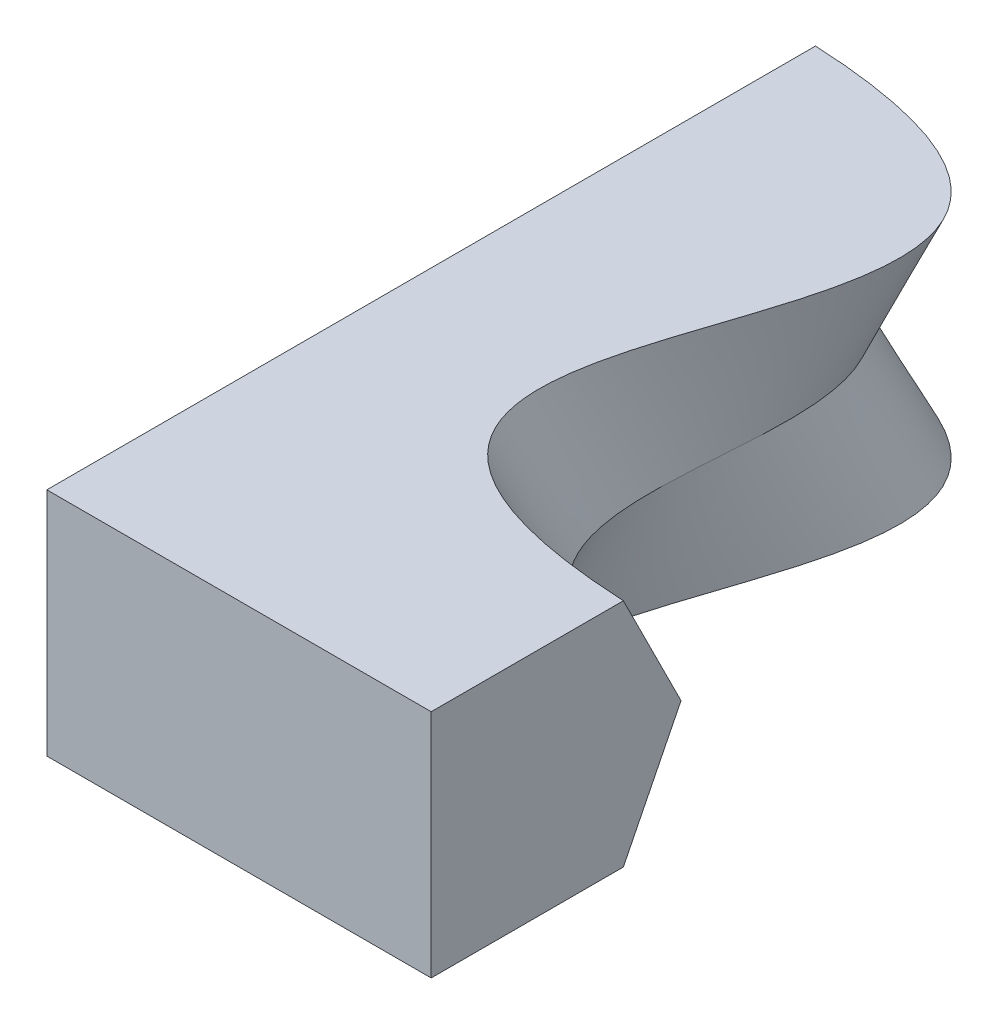
ISO-10303-21;
HEADER;
FILE_DESCRIPTION(('STEP AP214'),'2;1');
FILE_NAME('part.step','',(''),(''),'','','');
FILE_SCHEMA(('AUTOMOTIVE_DESIGN { 1 0 10303 214 1 1 1 1 }'));
ENDSEC;
DATA;
#1=APPLICATION_CONTEXT('core data for automotive mechanical design processes');
#2=APPLICATION_PROTOCOL_DEFINITION('international standard','automotive_design',2000,#1);
#3=PRODUCT_CONTEXT('',#1,'mechanical');
#4=PRODUCT('Part','Part','',(#3));
#5=PRODUCT_RELATED_PRODUCT_CATEGORY('part','',(#4));
#6=PRODUCT_DEFINITION_FORMATION('','',#4);
#7=PRODUCT_DEFINITION_CONTEXT('part definition',#1,'design');
#8=PRODUCT_DEFINITION('design','',#6,#7);
#9=PRODUCT_DEFINITION_SHAPE('','',#8);
#10=(LENGTH_UNIT() NAMED_UNIT(*) SI_UNIT(.MILLI.,.METRE.));
#11=(NAMED_UNIT(*) PLANE_ANGLE_UNIT() SI_UNIT($,.RADIAN.));
#12=(NAMED_UNIT(*) SI_UNIT($,.STERADIAN.) SOLID_ANGLE_UNIT());
#13=UNCERTAINTY_MEASURE_WITH_UNIT(LENGTH_MEASURE(1.E-05),#10,'distance_accuracy_value','');
#14=(GEOMETRIC_REPRESENTATION_CONTEXT(3) GLOBAL_UNCERTAINTY_ASSIGNED_CONTEXT((#13)) GLOBAL_UNIT_ASSIGNED_CONTEXT((#10,
#11,#12)) REPRESENTATION_CONTEXT('',''));
#15=CARTESIAN_POINT('',(0.,0.,0.));
#16=DIRECTION('',(0.,0.,1.));
#17=DIRECTION('',(1.,0.,0.));
#18=AXIS2_PLACEMENT_3D('',#15,#16,#17);
#19=CARTESIAN_POINT('',(1.,0.,-2.5));
#20=DIRECTION('',(0.,1.,0.));
#21=DIRECTION('',(0.,0.,1.));
#22=AXIS2_PLACEMENT_3D('',#19,#20,#21);
#23=PLANE('',#22);
#24=DIRECTION('',(0.,0.,1.));
#25=VECTOR('',#24,1.);
#26=CARTESIAN_POINT('',(0.,0.,0.));
#27=LINE('',#26,#25);
#28=CARTESIAN_POINT('',(0.,0.,-4.));
#29=VERTEX_POINT('',#28);
#30=CARTESIAN_POINT('',(0.,0.,0.));
#31=VERTEX_POINT('',#30);
#32=EDGE_CURVE('E133',#29,#31,#27,.T.);
#33=ORIENTED_EDGE('',*,*,#32,.F.);
#34=CARTESIAN_POINT('',(2.,0.,-1.));
#35=CARTESIAN_POINT('',(-0.939621293878363,0.,-1.1463183269814));
#36=CARTESIAN_POINT('',(2.93962129387836,0.,-3.8536816730186));
#37=CARTESIAN_POINT('',(0.,0.,-4.));
#38=B_SPLINE_CURVE_WITH_KNOTS('',3,(#34,#35,#36,#37),.UNSPECIFIED.,.F.,.F.,(4,4),(0.,1.),.UNSPECIFIED.);
#39=CARTESIAN_POINT('',(2.,0.,-1.));
#40=VERTEX_POINT('',#39);
#41=EDGE_CURVE('E97',#40,#29,#38,.T.);
#42=ORIENTED_EDGE('',*,*,#41,.F.);
#43=DIRECTION('',(0.,0.,-1.));
#44=VECTOR('',#43,1.);
#45=CARTESIAN_POINT('',(2.,0.,0.));
#46=LINE('',#45,#44);
#47=CARTESIAN_POINT('',(2.,0.,0.));
#48=VERTEX_POINT('',#47);
#49=EDGE_CURVE('E282',#48,#40,#46,.T.);
#50=ORIENTED_EDGE('',*,*,#49,.F.);
#51=DIRECTION('',(1.,0.,0.));
#52=VECTOR('',#51,1.);
#53=CARTESIAN_POINT('',(0.,0.,0.));
#54=LINE('',#53,#52);
#55=EDGE_CURVE('E279',#31,#48,#54,.T.);
#56=ORIENTED_EDGE('',*,*,#55,.F.);
#57=EDGE_LOOP('',(#33,#42,#50,#56));
#58=FACE_BOUND('',#57,.T.);
#59=ADVANCED_FACE('F71',(#58),#23,.F.);
#60=CARTESIAN_POINT('',(0.,0.,0.));
#61=DIRECTION('',(0.,0.,-1.));
#62=DIRECTION('',(-1.,0.,0.));
#63=AXIS2_PLACEMENT_3D('',#60,#61,#62);
#64=PLANE('',#63);
#65=DIRECTION('',(0.,1.,0.));
#66=VECTOR('',#65,1.);
#67=CARTESIAN_POINT('',(2.,0.,0.));
#68=LINE('',#67,#66);
#69=CARTESIAN_POINT('',(2.,1.2,0.));
#70=VERTEX_POINT('',#69);
#71=EDGE_CURVE('E138',#48,#70,#68,.T.);
#72=ORIENTED_EDGE('',*,*,#71,.T.);
#73=DIRECTION('',(1.,0.,0.));
#74=VECTOR('',#73,1.);
#75=CARTESIAN_POINT('',(0.,1.2,0.));
#76=LINE('',#75,#74);
#77=CARTESIAN_POINT('',(0.,1.2,0.));
#78=VERTEX_POINT('',#77);
#79=EDGE_CURVE('E141',#78,#70,#76,.T.);
#80=ORIENTED_EDGE('',*,*,#79,.F.);
#81=DIRECTION('',(0.,1.,0.));
#82=VECTOR('',#81,1.);
#83=CARTESIAN_POINT('',(0.,0.,0.));
#84=LINE('',#83,#82);
#85=EDGE_CURVE('E126',#31,#78,#84,.T.);
#86=ORIENTED_EDGE('',*,*,#85,.F.);
#87=ORIENTED_EDGE('',*,*,#55,.T.);
#88=EDGE_LOOP('',(#72,#80,#86,#87));
#89=FACE_BOUND('',#88,.T.);
#90=ADVANCED_FACE('F143',(#89),#64,.F.);
#91=CARTESIAN_POINT('',(0.,0.,0.));
#92=DIRECTION('',(1.,0.,0.));
#93=DIRECTION('',(0.,0.,-1.));
#94=AXIS2_PLACEMENT_3D('',#91,#92,#93);
#95=PLANE('',#94);
#96=ORIENTED_EDGE('',*,*,#85,.T.);
#97=DIRECTION('',(0.,0.,1.));
#98=VECTOR('',#97,1.);
#99=CARTESIAN_POINT('',(0.,1.2,0.));
#100=LINE('',#99,#98);
#101=CARTESIAN_POINT('',(0.,1.2,-4.));
#102=VERTEX_POINT('',#101);
#103=EDGE_CURVE('E131',#102,#78,#100,.T.);
#104=ORIENTED_EDGE('',*,*,#103,.F.);
#105=DIRECTION('',(0.,-0.894427190999916,0.447213595499958));
#106=VECTOR('',#105,1.);
#107=CARTESIAN_POINT('',(0.,0.9,-3.85));
#108=LINE('',#107,#106);
#109=CARTESIAN_POINT('',(0.,0.6,-3.7));
#110=VERTEX_POINT('',#109);
#111=EDGE_CURVE('E337',#102,#110,#108,.T.);
#112=ORIENTED_EDGE('',*,*,#111,.T.);
#113=DIRECTION('',(0.,0.894427190999916,0.447213595499958));
#114=VECTOR('',#113,1.);
#115=CARTESIAN_POINT('',(0.,0.3,-3.85));
#116=LINE('',#115,#114);
#117=EDGE_CURVE('E85',#29,#110,#116,.T.);
#118=ORIENTED_EDGE('',*,*,#117,.F.);
#119=ORIENTED_EDGE('',*,*,#32,.T.);
#120=EDGE_LOOP('',(#96,#104,#112,#118,#119));
#121=FACE_BOUND('',#120,.T.);
#122=ADVANCED_FACE('F128',(#121),#95,.F.);
#123=CARTESIAN_POINT('',(2.,0.,0.));
#124=DIRECTION('',(-1.,0.,0.));
#125=DIRECTION('',(0.,0.,1.));
#126=AXIS2_PLACEMENT_3D('',#123,#124,#125);
#127=PLANE('',#126);
#128=DIRECTION('',(0.,0.894427190999916,-0.447213595499958));
#129=VECTOR('',#128,1.);
#130=CARTESIAN_POINT('',(2.,0.,-1.));
#131=LINE('',#130,#129);
#132=CARTESIAN_POINT('',(2.,0.6,-1.3));
#133=VERTEX_POINT('',#132);
#134=EDGE_CURVE('E137',#40,#133,#131,.T.);
#135=ORIENTED_EDGE('',*,*,#134,.T.);
#136=DIRECTION('',(0.,-0.894427190999916,-0.447213595499958));
#137=VECTOR('',#136,1.);
#138=CARTESIAN_POINT('',(2.,1.2,-1.));
#139=LINE('',#138,#137);
#140=CARTESIAN_POINT('',(2.,1.2,-1.));
#141=VERTEX_POINT('',#140);
#142=EDGE_CURVE('E148',#141,#133,#139,.T.);
#143=ORIENTED_EDGE('',*,*,#142,.F.);
#144=DIRECTION('',(0.,0.,-1.));
#145=VECTOR('',#144,1.);
#146=CARTESIAN_POINT('',(2.,1.2,0.));
#147=LINE('',#146,#145);
#148=EDGE_CURVE('E149',#70,#141,#147,.T.);
#149=ORIENTED_EDGE('',*,*,#148,.F.);
#150=ORIENTED_EDGE('',*,*,#71,.F.);
#151=ORIENTED_EDGE('',*,*,#49,.T.);
#152=EDGE_LOOP('',(#135,#143,#149,#150,#151));
#153=FACE_BOUND('',#152,.T.);
#154=ADVANCED_FACE('F218',(#153),#127,.F.);
#155=CARTESIAN_POINT('',(2.,0.,-1.));
#156=CARTESIAN_POINT('',(2.00000000000001,0.6,-1.3));
#157=CARTESIAN_POINT('',(-0.939621293878363,0.,-1.1463183269814));
#158=CARTESIAN_POINT('',(-0.166666666666679,0.6,-1.3));
#159=CARTESIAN_POINT('',(2.93962129387836,0.,-3.8536816730186));
#160=CARTESIAN_POINT('',(2.16666666666667,0.6,-3.7));
#161=CARTESIAN_POINT('',(0.,0.,-4.));
#162=CARTESIAN_POINT('',(0.,0.6,-3.7));
#163=B_SPLINE_SURFACE_WITH_KNOTS('',3,1,((#155,#156),(#157,#158),(#159,#160),(#161,#162)),
.UNSPECIFIED.,.F.,.F.,.F.,(4,4),(2,2),(0.,1.),(0.,1.),.UNSPECIFIED.);
#164=CARTESIAN_POINT('',(2.00000000000001,0.6,-1.3));
#165=CARTESIAN_POINT('',(-0.166666666666679,0.6,-1.3));
#166=CARTESIAN_POINT('',(2.16666666666667,0.6,-3.7));
#167=CARTESIAN_POINT('',(0.,0.6,-3.7));
#168=B_SPLINE_CURVE_WITH_KNOTS('',3,(#164,#165,#166,#167),.UNSPECIFIED.,.F.,.F.,(4,4),(0.,1.),.UNSPECIFIED.);
#169=EDGE_CURVE('E12',#133,#110,#168,.T.);
#170=ORIENTED_EDGE('',*,*,#41,.T.);
#171=ORIENTED_EDGE('',*,*,#117,.T.);
#172=ORIENTED_EDGE('',*,*,#169,.F.);
#173=ORIENTED_EDGE('',*,*,#134,.F.);
#174=EDGE_LOOP('',(#170,#171,#172,#173));
#175=FACE_BOUND('',#174,.T.);
#176=ADVANCED_FACE('F73',(#175),#163,.T.);
#177=CARTESIAN_POINT('',(1.,1.2,-2.5));
#178=DIRECTION('',(0.,-1.,0.));
#179=DIRECTION('',(0.,0.,1.));
#180=AXIS2_PLACEMENT_3D('',#177,#178,#179);
#181=PLANE('',#180);
#182=ORIENTED_EDGE('',*,*,#103,.T.);
#183=ORIENTED_EDGE('',*,*,#79,.T.);
#184=ORIENTED_EDGE('',*,*,#148,.T.);
#185=CARTESIAN_POINT('',(2.,1.2,-1.));
#186=CARTESIAN_POINT('',(-0.939621293878363,1.2,-1.1463183269814));
#187=CARTESIAN_POINT('',(2.93962129387836,1.2,-3.8536816730186));
#188=CARTESIAN_POINT('',(0.,1.2,-4.));
#189=B_SPLINE_CURVE_WITH_KNOTS('',3,(#185,#186,#187,#188),.UNSPECIFIED.,.F.,.F.,(4,4),(0.,1.),.UNSPECIFIED.);
#190=EDGE_CURVE('E157',#141,#102,#189,.T.);
#191=ORIENTED_EDGE('',*,*,#190,.T.);
#192=EDGE_LOOP('',(#182,#183,#184,#191));
#193=FACE_BOUND('',#192,.T.);
#194=ADVANCED_FACE('F155',(#193),#181,.F.);
#195=CARTESIAN_POINT('',(2.,1.2,-1.));
#196=CARTESIAN_POINT('',(2.00000000000001,0.6,-1.3));
#197=CARTESIAN_POINT('',(-0.939621293878363,1.2,-1.1463183269814));
#198=CARTESIAN_POINT('',(-0.166666666666679,0.6,-1.3));
#199=CARTESIAN_POINT('',(2.93962129387836,1.2,-3.8536816730186));
#200=CARTESIAN_POINT('',(2.16666666666667,0.6,-3.7));
#201=CARTESIAN_POINT('',(0.,1.2,-4.));
#202=CARTESIAN_POINT('',(0.,0.6,-3.7));
#203=B_SPLINE_SURFACE_WITH_KNOTS('',3,1,((#195,#196),(#197,#198),(#199,#200),(#201,#202)),
.UNSPECIFIED.,.F.,.F.,.F.,(4,4),(2,2),(0.,1.),(0.,1.),.UNSPECIFIED.);
#204=ORIENTED_EDGE('',*,*,#190,.F.);
#205=ORIENTED_EDGE('',*,*,#142,.T.);
#206=ORIENTED_EDGE('',*,*,#169,.T.);
#207=ORIENTED_EDGE('',*,*,#111,.F.);
#208=EDGE_LOOP('',(#204,#205,#206,#207));
#209=FACE_BOUND('',#208,.T.);
#210=ADVANCED_FACE('F177',(#209),#203,.F.);
#211=CLOSED_SHELL('',(#59,#90,#122,#154,#176,#194,#210));
#212=MANIFOLD_SOLID_BREP('B2',#211);
#213=ADVANCED_BREP_SHAPE_REPRESENTATION('',(#18,#212),#14);
#214=SHAPE_DEFINITION_REPRESENTATION(#9,#213);
ENDSEC;
END-ISO-10303-21;
